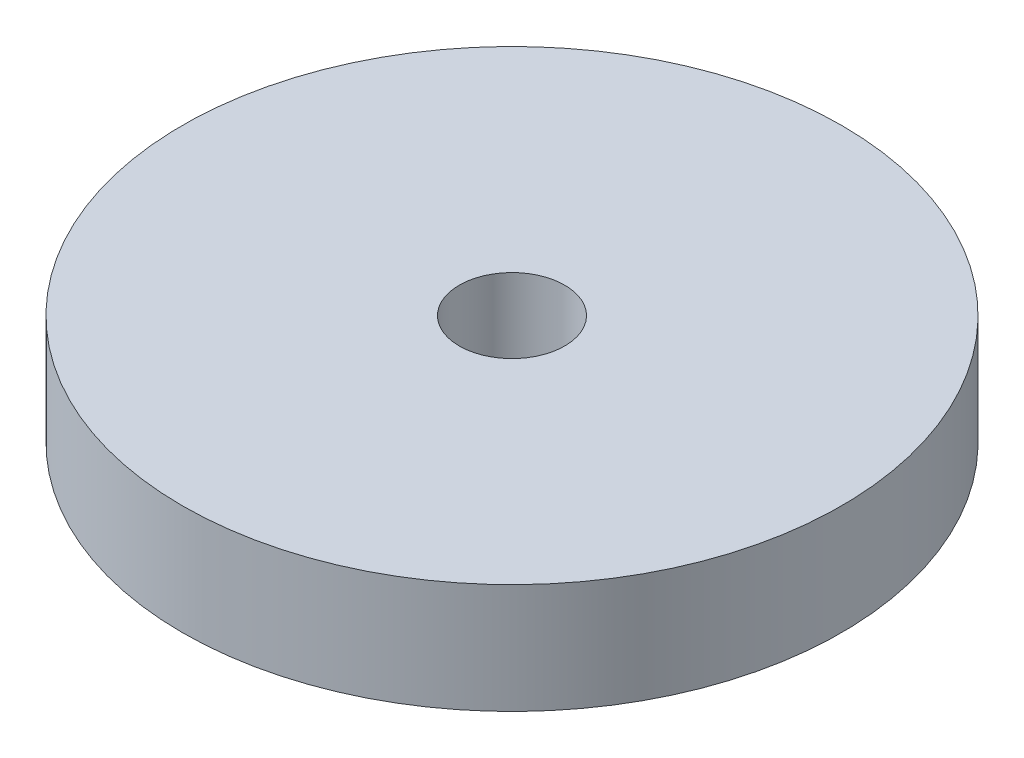
ISO-10303-21;
HEADER;
FILE_DESCRIPTION(('STEP AP214'),'2;1');
FILE_NAME('part.step','',(''),(''),'','','');
FILE_SCHEMA(('AUTOMOTIVE_DESIGN { 1 0 10303 214 1 1 1 1 }'));
ENDSEC;
DATA;
#1=APPLICATION_CONTEXT('core data for automotive mechanical design processes');
#2=APPLICATION_PROTOCOL_DEFINITION('international standard','automotive_design',2000,#1);
#3=PRODUCT_CONTEXT('',#1,'mechanical');
#4=PRODUCT('Part','Part','',(#3));
#5=PRODUCT_RELATED_PRODUCT_CATEGORY('part','',(#4));
#6=PRODUCT_DEFINITION_FORMATION('','',#4);
#7=PRODUCT_DEFINITION_CONTEXT('part definition',#1,'design');
#8=PRODUCT_DEFINITION('design','',#6,#7);
#9=PRODUCT_DEFINITION_SHAPE('','',#8);
#10=(LENGTH_UNIT() NAMED_UNIT(*) SI_UNIT(.MILLI.,.METRE.));
#11=(NAMED_UNIT(*) PLANE_ANGLE_UNIT() SI_UNIT($,.RADIAN.));
#12=(NAMED_UNIT(*) SI_UNIT($,.STERADIAN.) SOLID_ANGLE_UNIT());
#13=UNCERTAINTY_MEASURE_WITH_UNIT(LENGTH_MEASURE(1.E-05),#10,'distance_accuracy_value','');
#14=(GEOMETRIC_REPRESENTATION_CONTEXT(3) GLOBAL_UNCERTAINTY_ASSIGNED_CONTEXT((#13)) GLOBAL_UNIT_ASSIGNED_CONTEXT((#10,
#11,#12)) REPRESENTATION_CONTEXT('',''));
#15=CARTESIAN_POINT('',(0.,0.,0.));
#16=DIRECTION('',(0.,0.,1.));
#17=DIRECTION('',(1.,0.,0.));
#18=AXIS2_PLACEMENT_3D('',#15,#16,#17);
#19=CARTESIAN_POINT('',(0.,5.,0.));
#20=DIRECTION('',(0.,1.,0.));
#21=DIRECTION('',(0.,0.,1.));
#22=AXIS2_PLACEMENT_3D('',#19,#20,#21);
#23=PLANE('',#22);
#24=CARTESIAN_POINT('',(0.,5.,0.));
#25=DIRECTION('',(0.,1.,0.));
#26=DIRECTION('',(0.,0.,1.));
#27=AXIS2_PLACEMENT_3D('',#24,#25,#26);
#28=CIRCLE('',#27,15.);
#29=CARTESIAN_POINT('',(0.,5.,15.));
#30=VERTEX_POINT('',#29);
#31=EDGE_CURVE('E10',#30,#30,#28,.T.);
#32=ORIENTED_EDGE('',*,*,#31,.T.);
#33=EDGE_LOOP('',(#32));
#34=FACE_BOUND('',#33,.T.);
#35=CARTESIAN_POINT('',(0.,5.,0.));
#36=DIRECTION('',(0.,1.,0.));
#37=DIRECTION('',(0.,0.,1.));
#38=AXIS2_PLACEMENT_3D('',#35,#36,#37);
#39=CIRCLE('',#38,2.4);
#40=CARTESIAN_POINT('',(0.,5.,2.4));
#41=VERTEX_POINT('',#40);
#42=EDGE_CURVE('E46',#41,#41,#39,.T.);
#43=ORIENTED_EDGE('',*,*,#42,.F.);
#44=EDGE_LOOP('',(#43));
#45=FACE_BOUND('',#44,.T.);
#46=ADVANCED_FACE('F35',(#34,#45),#23,.T.);
#47=CARTESIAN_POINT('',(0.,0.,0.));
#48=DIRECTION('',(0.,1.,0.));
#49=DIRECTION('',(0.,0.,1.));
#50=AXIS2_PLACEMENT_3D('',#47,#48,#49);
#51=PLANE('',#50);
#52=CARTESIAN_POINT('',(0.,0.,0.));
#53=DIRECTION('',(0.,1.,0.));
#54=DIRECTION('',(0.,0.,1.));
#55=AXIS2_PLACEMENT_3D('',#52,#53,#54);
#56=CIRCLE('',#55,15.);
#57=CARTESIAN_POINT('',(0.,0.,15.));
#58=VERTEX_POINT('',#57);
#59=EDGE_CURVE('E39',#58,#58,#56,.T.);
#60=ORIENTED_EDGE('',*,*,#59,.F.);
#61=EDGE_LOOP('',(#60));
#62=FACE_BOUND('',#61,.T.);
#63=CARTESIAN_POINT('',(0.,0.,0.));
#64=DIRECTION('',(0.,1.,0.));
#65=DIRECTION('',(0.,0.,1.));
#66=AXIS2_PLACEMENT_3D('',#63,#64,#65);
#67=CIRCLE('',#66,2.4);
#68=CARTESIAN_POINT('',(0.,0.,2.4));
#69=VERTEX_POINT('',#68);
#70=EDGE_CURVE('E48',#69,#69,#67,.T.);
#71=ORIENTED_EDGE('',*,*,#70,.T.);
#72=EDGE_LOOP('',(#71));
#73=FACE_BOUND('',#72,.T.);
#74=ADVANCED_FACE('F58',(#62,#73),#51,.F.);
#75=CARTESIAN_POINT('',(0.,5.,0.));
#76=DIRECTION('',(0.,-1.,0.));
#77=DIRECTION('',(0.,0.,-1.));
#78=AXIS2_PLACEMENT_3D('',#75,#76,#77);
#79=CYLINDRICAL_SURFACE('',#78,15.);
#80=ORIENTED_EDGE('',*,*,#31,.F.);
#81=EDGE_LOOP('',(#80));
#82=FACE_BOUND('',#81,.T.);
#83=ORIENTED_EDGE('',*,*,#59,.T.);
#84=EDGE_LOOP('',(#83));
#85=FACE_BOUND('',#84,.T.);
#86=ADVANCED_FACE('F37',(#82,#85),#79,.T.);
#87=CARTESIAN_POINT('',(0.,5.,0.));
#88=DIRECTION('',(0.,-1.,0.));
#89=DIRECTION('',(0.,0.,-1.));
#90=AXIS2_PLACEMENT_3D('',#87,#88,#89);
#91=CYLINDRICAL_SURFACE('',#90,2.4);
#92=ORIENTED_EDGE('',*,*,#42,.T.);
#93=EDGE_LOOP('',(#92));
#94=FACE_BOUND('',#93,.T.);
#95=ORIENTED_EDGE('',*,*,#70,.F.);
#96=EDGE_LOOP('',(#95));
#97=FACE_BOUND('',#96,.T.);
#98=ADVANCED_FACE('F54',(#94,#97),#91,.F.);
#99=CLOSED_SHELL('',(#46,#74,#86,#98));
#100=MANIFOLD_SOLID_BREP('B2',#99);
#101=ADVANCED_BREP_SHAPE_REPRESENTATION('',(#18,#100),#14);
#102=SHAPE_DEFINITION_REPRESENTATION(#9,#101);
ENDSEC;
END-ISO-10303-21;
